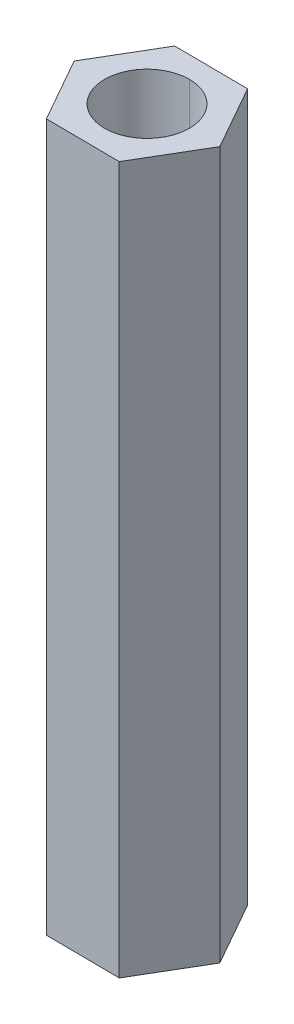
ISO-10303-21;
HEADER;
FILE_DESCRIPTION(('STEP AP214'),'2;1');
FILE_NAME('part.step','',(''),(''),'','','');
FILE_SCHEMA(('AUTOMOTIVE_DESIGN { 1 0 10303 214 1 1 1 1 }'));
ENDSEC;
DATA;
#1=APPLICATION_CONTEXT('core data for automotive mechanical design processes');
#2=APPLICATION_PROTOCOL_DEFINITION('international standard','automotive_design',2000,#1);
#3=PRODUCT_CONTEXT('',#1,'mechanical');
#4=PRODUCT('Part','Part','',(#3));
#5=PRODUCT_RELATED_PRODUCT_CATEGORY('part','',(#4));
#6=PRODUCT_DEFINITION_FORMATION('','',#4);
#7=PRODUCT_DEFINITION_CONTEXT('part definition',#1,'design');
#8=PRODUCT_DEFINITION('design','',#6,#7);
#9=PRODUCT_DEFINITION_SHAPE('','',#8);
#10=(LENGTH_UNIT() NAMED_UNIT(*) SI_UNIT(.MILLI.,.METRE.));
#11=(NAMED_UNIT(*) PLANE_ANGLE_UNIT() SI_UNIT($,.RADIAN.));
#12=(NAMED_UNIT(*) SI_UNIT($,.STERADIAN.) SOLID_ANGLE_UNIT());
#13=UNCERTAINTY_MEASURE_WITH_UNIT(LENGTH_MEASURE(1.E-05),#10,'distance_accuracy_value','');
#14=(GEOMETRIC_REPRESENTATION_CONTEXT(3) GLOBAL_UNCERTAINTY_ASSIGNED_CONTEXT((#13)) GLOBAL_UNIT_ASSIGNED_CONTEXT((#10,
#11,#12)) REPRESENTATION_CONTEXT('',''));
#15=CARTESIAN_POINT('',(0.,0.,0.));
#16=DIRECTION('',(0.,0.,1.));
#17=DIRECTION('',(1.,0.,0.));
#18=AXIS2_PLACEMENT_3D('',#15,#16,#17);
#19=CARTESIAN_POINT('',(0.,25.,0.));
#20=DIRECTION('',(0.,-1.,0.));
#21=DIRECTION('',(0.,0.,-1.));
#22=AXIS2_PLACEMENT_3D('',#19,#20,#21);
#23=CYLINDRICAL_SURFACE('',#22,1.5);
#24=CARTESIAN_POINT('',(0.,25.,0.));
#25=DIRECTION('',(0.,1.,0.));
#26=DIRECTION('',(0.,0.,1.));
#27=AXIS2_PLACEMENT_3D('',#24,#25,#26);
#28=CIRCLE('',#27,1.5);
#29=CARTESIAN_POINT('',(0.,25.,-1.5));
#30=VERTEX_POINT('',#29);
#31=CARTESIAN_POINT('',(0.,25.,1.5));
#32=VERTEX_POINT('',#31);
#33=EDGE_CURVE('E11',#30,#32,#28,.T.);
#34=ORIENTED_EDGE('',*,*,#33,.T.);
#35=DIRECTION('',(0.,-1.,0.));
#36=VECTOR('',#35,1.);
#37=CARTESIAN_POINT('',(0.,25.,1.5));
#38=LINE('',#37,#36);
#39=CARTESIAN_POINT('',(0.,0.,1.5));
#40=VERTEX_POINT('',#39);
#41=EDGE_CURVE('E27',#32,#40,#38,.T.);
#42=ORIENTED_EDGE('',*,*,#41,.T.);
#43=CARTESIAN_POINT('',(0.,0.,0.));
#44=DIRECTION('',(0.,1.,0.));
#45=DIRECTION('',(0.,0.,1.));
#46=AXIS2_PLACEMENT_3D('',#43,#44,#45);
#47=CIRCLE('',#46,1.5);
#48=CARTESIAN_POINT('',(0.,0.,-1.5));
#49=VERTEX_POINT('',#48);
#50=EDGE_CURVE('E20',#49,#40,#47,.T.);
#51=ORIENTED_EDGE('',*,*,#50,.F.);
#52=DIRECTION('',(0.,-1.,0.));
#53=VECTOR('',#52,1.);
#54=CARTESIAN_POINT('',(0.,25.,-1.5));
#55=LINE('',#54,#53);
#56=EDGE_CURVE('E173',#30,#49,#55,.T.);
#57=ORIENTED_EDGE('',*,*,#56,.F.);
#58=EDGE_LOOP('',(#34,#42,#51,#57));
#59=FACE_BOUND('',#58,.T.);
#60=ADVANCED_FACE('F16',(#59),#23,.F.);
#61=CARTESIAN_POINT('',(0.,25.,0.));
#62=DIRECTION('',(0.,1.,0.));
#63=DIRECTION('',(1.,0.,0.));
#64=AXIS2_PLACEMENT_3D('',#61,#62,#63);
#65=PLANE('',#64);
#66=DIRECTION('',(-0.4924858619026,0.,-0.870320444334185));
#67=VECTOR('',#66,1.);
#68=CARTESIAN_POINT('',(2.5979789008704,25.,0.0224862320586959));
#69=LINE('',#68,#67);
#70=CARTESIAN_POINT('',(2.5979789008704,25.,0.0224862320586959));
#71=VERTEX_POINT('',#70);
#72=CARTESIAN_POINT('',(1.31846309863343,25.,-2.23867261062039));
#73=VERTEX_POINT('',#72);
#74=EDGE_CURVE('E177',#71,#73,#69,.T.);
#75=ORIENTED_EDGE('',*,*,#74,.T.);
#76=DIRECTION('',(-0.999962545177665,0.,-0.00865495475476602));
#77=VECTOR('',#76,1.);
#78=CARTESIAN_POINT('',(1.31846309863343,25.,-2.23867261062039));
#79=LINE('',#78,#77);
#80=CARTESIAN_POINT('',(-1.27951580223698,25.,-2.26115884267909));
#81=VERTEX_POINT('',#80);
#82=EDGE_CURVE('E184',#73,#81,#79,.T.);
#83=ORIENTED_EDGE('',*,*,#82,.T.);
#84=DIRECTION('',(-0.507476683275064,0.,0.861665489579419));
#85=VECTOR('',#84,1.);
#86=CARTESIAN_POINT('',(-1.27951580223698,25.,-2.26115884267909));
#87=LINE('',#86,#85);
#88=CARTESIAN_POINT('',(-2.5979789008704,25.,-0.0224862320586956));
#89=VERTEX_POINT('',#88);
#90=EDGE_CURVE('E126',#81,#89,#87,.T.);
#91=ORIENTED_EDGE('',*,*,#90,.T.);
#92=DIRECTION('',(0.4924858619026,0.,0.870320444334185));
#93=VECTOR('',#92,1.);
#94=CARTESIAN_POINT('',(-2.5979789008704,25.,-0.0224862320586956));
#95=LINE('',#94,#93);
#96=CARTESIAN_POINT('',(-1.31846309863343,25.,2.23867261062039));
#97=VERTEX_POINT('',#96);
#98=EDGE_CURVE('E138',#89,#97,#95,.T.);
#99=ORIENTED_EDGE('',*,*,#98,.T.);
#100=DIRECTION('',(0.999962545177665,0.,0.00865495475476585));
#101=VECTOR('',#100,1.);
#102=CARTESIAN_POINT('',(-1.31846309863343,25.,2.23867261062039));
#103=LINE('',#102,#101);
#104=CARTESIAN_POINT('',(1.27951580223698,25.,2.26115884267909));
#105=VERTEX_POINT('',#104);
#106=EDGE_CURVE('E141',#97,#105,#103,.T.);
#107=ORIENTED_EDGE('',*,*,#106,.T.);
#108=DIRECTION('',(0.507476683275064,0.,-0.861665489579419));
#109=VECTOR('',#108,1.);
#110=CARTESIAN_POINT('',(1.27951580223698,25.,2.26115884267909));
#111=LINE('',#110,#109);
#112=EDGE_CURVE('E151',#105,#71,#111,.T.);
#113=ORIENTED_EDGE('',*,*,#112,.T.);
#114=EDGE_LOOP('',(#75,#83,#91,#99,#107,#113));
#115=FACE_BOUND('',#114,.T.);
#116=ORIENTED_EDGE('',*,*,#33,.F.);
#117=CARTESIAN_POINT('',(0.,25.,0.));
#118=DIRECTION('',(0.,1.,0.));
#119=DIRECTION('',(0.,0.,1.));
#120=AXIS2_PLACEMENT_3D('',#117,#118,#119);
#121=CIRCLE('',#120,1.5);
#122=EDGE_CURVE('E147',#32,#30,#121,.T.);
#123=ORIENTED_EDGE('',*,*,#122,.F.);
#124=EDGE_LOOP('',(#116,#123));
#125=FACE_BOUND('',#124,.T.);
#126=ADVANCED_FACE('F206',(#115,#125),#65,.T.);
#127=CARTESIAN_POINT('',(0.,0.,0.));
#128=DIRECTION('',(0.,1.,0.));
#129=DIRECTION('',(1.,0.,0.));
#130=AXIS2_PLACEMENT_3D('',#127,#128,#129);
#131=PLANE('',#130);
#132=DIRECTION('',(-0.4924858619026,0.,-0.870320444334185));
#133=VECTOR('',#132,1.);
#134=CARTESIAN_POINT('',(2.5979789008704,0.,0.0224862320586959));
#135=LINE('',#134,#133);
#136=CARTESIAN_POINT('',(2.5979789008704,0.,0.0224862320586959));
#137=VERTEX_POINT('',#136);
#138=CARTESIAN_POINT('',(1.31846309863343,0.,-2.23867261062039));
#139=VERTEX_POINT('',#138);
#140=EDGE_CURVE('E152',#137,#139,#135,.T.);
#141=ORIENTED_EDGE('',*,*,#140,.F.);
#142=DIRECTION('',(0.507476683275064,0.,-0.861665489579419));
#143=VECTOR('',#142,1.);
#144=CARTESIAN_POINT('',(1.27951580223698,0.,2.26115884267909));
#145=LINE('',#144,#143);
#146=CARTESIAN_POINT('',(1.27951580223698,0.,2.26115884267909));
#147=VERTEX_POINT('',#146);
#148=EDGE_CURVE('E146',#147,#137,#145,.T.);
#149=ORIENTED_EDGE('',*,*,#148,.F.);
#150=DIRECTION('',(0.999962545177665,0.,0.00865495475476585));
#151=VECTOR('',#150,1.);
#152=CARTESIAN_POINT('',(-1.31846309863343,0.,2.23867261062039));
#153=LINE('',#152,#151);
#154=CARTESIAN_POINT('',(-1.31846309863343,0.,2.23867261062039));
#155=VERTEX_POINT('',#154);
#156=EDGE_CURVE('E169',#155,#147,#153,.T.);
#157=ORIENTED_EDGE('',*,*,#156,.F.);
#158=DIRECTION('',(0.4924858619026,0.,0.870320444334185));
#159=VECTOR('',#158,1.);
#160=CARTESIAN_POINT('',(-2.5979789008704,0.,-0.0224862320586956));
#161=LINE('',#160,#159);
#162=CARTESIAN_POINT('',(-2.5979789008704,0.,-0.0224862320586956));
#163=VERTEX_POINT('',#162);
#164=EDGE_CURVE('E108',#163,#155,#161,.T.);
#165=ORIENTED_EDGE('',*,*,#164,.F.);
#166=DIRECTION('',(-0.507476683275064,0.,0.861665489579419));
#167=VECTOR('',#166,1.);
#168=CARTESIAN_POINT('',(-1.27951580223698,0.,-2.26115884267909));
#169=LINE('',#168,#167);
#170=CARTESIAN_POINT('',(-1.27951580223698,0.,-2.26115884267909));
#171=VERTEX_POINT('',#170);
#172=EDGE_CURVE('E100',#171,#163,#169,.T.);
#173=ORIENTED_EDGE('',*,*,#172,.F.);
#174=DIRECTION('',(-0.999962545177665,0.,-0.00865495475476602));
#175=VECTOR('',#174,1.);
#176=CARTESIAN_POINT('',(1.31846309863343,0.,-2.23867261062039));
#177=LINE('',#176,#175);
#178=EDGE_CURVE('E105',#139,#171,#177,.T.);
#179=ORIENTED_EDGE('',*,*,#178,.F.);
#180=EDGE_LOOP('',(#141,#149,#157,#165,#173,#179));
#181=FACE_BOUND('',#180,.T.);
#182=ORIENTED_EDGE('',*,*,#50,.T.);
#183=CARTESIAN_POINT('',(0.,0.,0.));
#184=DIRECTION('',(0.,1.,0.));
#185=DIRECTION('',(0.,0.,1.));
#186=AXIS2_PLACEMENT_3D('',#183,#184,#185);
#187=CIRCLE('',#186,1.5);
#188=EDGE_CURVE('E154',#40,#49,#187,.T.);
#189=ORIENTED_EDGE('',*,*,#188,.T.);
#190=EDGE_LOOP('',(#182,#189));
#191=FACE_BOUND('',#190,.T.);
#192=ADVANCED_FACE('F103',(#181,#191),#131,.F.);
#193=CARTESIAN_POINT('',(2.5979789008704,25.,0.0224862320586959));
#194=DIRECTION('',(-0.870320444334185,0.,0.4924858619026));
#195=DIRECTION('',(0.,1.,0.));
#196=AXIS2_PLACEMENT_3D('',#193,#194,#195);
#197=PLANE('',#196);
#198=ORIENTED_EDGE('',*,*,#140,.T.);
#199=DIRECTION('',(0.,-1.,0.));
#200=VECTOR('',#199,1.);
#201=CARTESIAN_POINT('',(1.31846309863343,25.,-2.23867261062039));
#202=LINE('',#201,#200);
#203=EDGE_CURVE('E114',#73,#139,#202,.T.);
#204=ORIENTED_EDGE('',*,*,#203,.F.);
#205=ORIENTED_EDGE('',*,*,#74,.F.);
#206=DIRECTION('',(0.,-1.,0.));
#207=VECTOR('',#206,1.);
#208=CARTESIAN_POINT('',(2.5979789008704,25.,0.0224862320586959));
#209=LINE('',#208,#207);
#210=EDGE_CURVE('E123',#71,#137,#209,.T.);
#211=ORIENTED_EDGE('',*,*,#210,.T.);
#212=EDGE_LOOP('',(#198,#204,#205,#211));
#213=FACE_BOUND('',#212,.T.);
#214=ADVANCED_FACE('F226',(#213),#197,.F.);
#215=CARTESIAN_POINT('',(1.31846309863343,25.,-2.23867261062039));
#216=DIRECTION('',(-0.00865495475476602,0.,0.999962545177665));
#217=DIRECTION('',(0.,1.,0.));
#218=AXIS2_PLACEMENT_3D('',#215,#216,#217);
#219=PLANE('',#218);
#220=ORIENTED_EDGE('',*,*,#178,.T.);
#221=DIRECTION('',(0.,-1.,0.));
#222=VECTOR('',#221,1.);
#223=CARTESIAN_POINT('',(-1.27951580223698,25.,-2.26115884267909));
#224=LINE('',#223,#222);
#225=EDGE_CURVE('E115',#81,#171,#224,.T.);
#226=ORIENTED_EDGE('',*,*,#225,.F.);
#227=ORIENTED_EDGE('',*,*,#82,.F.);
#228=ORIENTED_EDGE('',*,*,#203,.T.);
#229=EDGE_LOOP('',(#220,#226,#227,#228));
#230=FACE_BOUND('',#229,.T.);
#231=ADVANCED_FACE('F120',(#230),#219,.F.);
#232=CARTESIAN_POINT('',(-1.27951580223698,25.,-2.26115884267909));
#233=DIRECTION('',(0.861665489579419,0.,0.507476683275064));
#234=DIRECTION('',(0.,-1.,0.));
#235=AXIS2_PLACEMENT_3D('',#232,#233,#234);
#236=PLANE('',#235);
#237=ORIENTED_EDGE('',*,*,#172,.T.);
#238=DIRECTION('',(0.,-1.,0.));
#239=VECTOR('',#238,1.);
#240=CARTESIAN_POINT('',(-2.5979789008704,25.,-0.0224862320586956));
#241=LINE('',#240,#239);
#242=EDGE_CURVE('E134',#89,#163,#241,.T.);
#243=ORIENTED_EDGE('',*,*,#242,.F.);
#244=ORIENTED_EDGE('',*,*,#90,.F.);
#245=ORIENTED_EDGE('',*,*,#225,.T.);
#246=EDGE_LOOP('',(#237,#243,#244,#245));
#247=FACE_BOUND('',#246,.T.);
#248=ADVANCED_FACE('F124',(#247),#236,.F.);
#249=CARTESIAN_POINT('',(-2.5979789008704,25.,-0.0224862320586956));
#250=DIRECTION('',(0.870320444334185,0.,-0.4924858619026));
#251=DIRECTION('',(0.,-1.,0.));
#252=AXIS2_PLACEMENT_3D('',#249,#250,#251);
#253=PLANE('',#252);
#254=ORIENTED_EDGE('',*,*,#164,.T.);
#255=DIRECTION('',(0.,-1.,0.));
#256=VECTOR('',#255,1.);
#257=CARTESIAN_POINT('',(-1.31846309863343,25.,2.23867261062039));
#258=LINE('',#257,#256);
#259=EDGE_CURVE('E160',#97,#155,#258,.T.);
#260=ORIENTED_EDGE('',*,*,#259,.F.);
#261=ORIENTED_EDGE('',*,*,#98,.F.);
#262=ORIENTED_EDGE('',*,*,#242,.T.);
#263=EDGE_LOOP('',(#254,#260,#261,#262));
#264=FACE_BOUND('',#263,.T.);
#265=ADVANCED_FACE('F209',(#264),#253,.F.);
#266=CARTESIAN_POINT('',(-1.31846309863343,25.,2.23867261062039));
#267=DIRECTION('',(0.00865495475476585,0.,-0.999962545177665));
#268=DIRECTION('',(0.,-1.,0.));
#269=AXIS2_PLACEMENT_3D('',#266,#267,#268);
#270=PLANE('',#269);
#271=ORIENTED_EDGE('',*,*,#156,.T.);
#272=DIRECTION('',(0.,-1.,0.));
#273=VECTOR('',#272,1.);
#274=CARTESIAN_POINT('',(1.27951580223698,25.,2.26115884267909));
#275=LINE('',#274,#273);
#276=EDGE_CURVE('E142',#105,#147,#275,.T.);
#277=ORIENTED_EDGE('',*,*,#276,.F.);
#278=ORIENTED_EDGE('',*,*,#106,.F.);
#279=ORIENTED_EDGE('',*,*,#259,.T.);
#280=EDGE_LOOP('',(#271,#277,#278,#279));
#281=FACE_BOUND('',#280,.T.);
#282=ADVANCED_FACE('F199',(#281),#270,.F.);
#283=CARTESIAN_POINT('',(1.27951580223698,25.,2.26115884267909));
#284=DIRECTION('',(-0.861665489579419,0.,-0.507476683275064));
#285=DIRECTION('',(-0.507476683275064,0.,0.861665489579419));
#286=AXIS2_PLACEMENT_3D('',#283,#284,#285);
#287=PLANE('',#286);
#288=ORIENTED_EDGE('',*,*,#148,.T.);
#289=ORIENTED_EDGE('',*,*,#210,.F.);
#290=ORIENTED_EDGE('',*,*,#112,.F.);
#291=ORIENTED_EDGE('',*,*,#276,.T.);
#292=EDGE_LOOP('',(#288,#289,#290,#291));
#293=FACE_BOUND('',#292,.T.);
#294=ADVANCED_FACE('F18',(#293),#287,.F.);
#295=CARTESIAN_POINT('',(0.,25.,0.));
#296=DIRECTION('',(0.,-1.,0.));
#297=DIRECTION('',(0.,0.,-1.));
#298=AXIS2_PLACEMENT_3D('',#295,#296,#297);
#299=CYLINDRICAL_SURFACE('',#298,1.5);
#300=ORIENTED_EDGE('',*,*,#41,.F.);
#301=ORIENTED_EDGE('',*,*,#122,.T.);
#302=ORIENTED_EDGE('',*,*,#56,.T.);
#303=ORIENTED_EDGE('',*,*,#188,.F.);
#304=EDGE_LOOP('',(#300,#301,#302,#303));
#305=FACE_BOUND('',#304,.T.);
#306=ADVANCED_FACE('F237',(#305),#299,.F.);
#307=CLOSED_SHELL('',(#60,#126,#192,#214,#231,#248,#265,#282,#294,#306));
#308=MANIFOLD_SOLID_BREP('B1',#307);
#309=ADVANCED_BREP_SHAPE_REPRESENTATION('',(#18,#308),#14);
#310=SHAPE_DEFINITION_REPRESENTATION(#9,#309);
ENDSEC;
END-ISO-10303-21;
